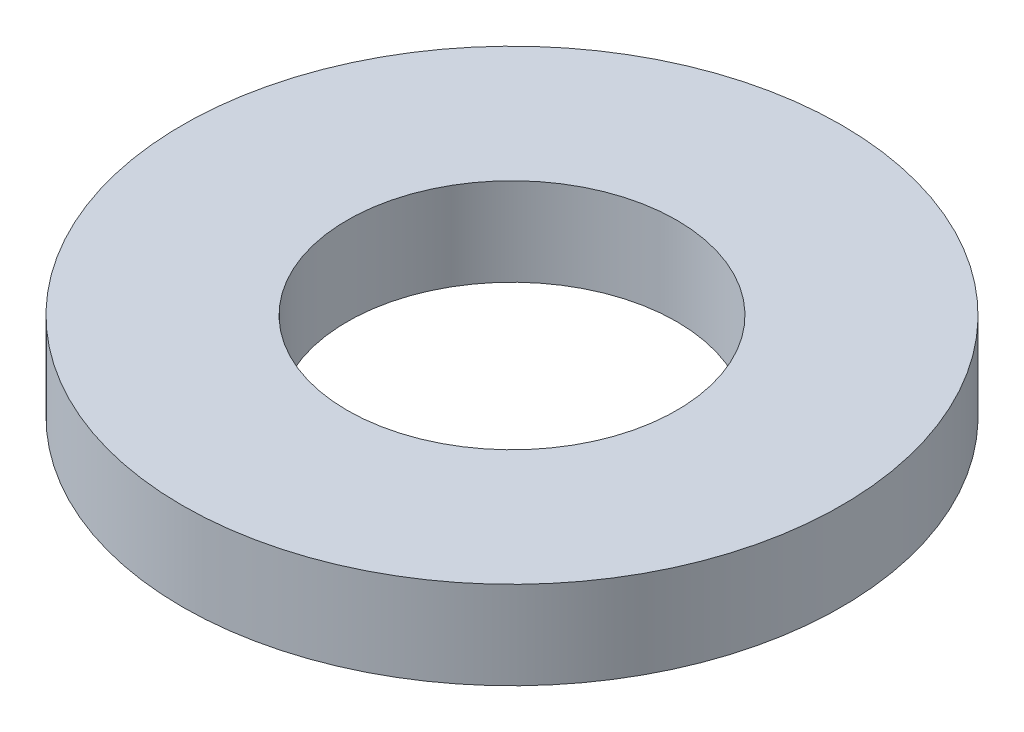
ISO-10303-21;
HEADER;
FILE_DESCRIPTION(('STEP AP214'),'2;1');
FILE_NAME('part.step','',(''),(''),'','','');
FILE_SCHEMA(('AUTOMOTIVE_DESIGN { 1 0 10303 214 1 1 1 1 }'));
ENDSEC;
DATA;
#1=APPLICATION_CONTEXT('core data for automotive mechanical design processes');
#2=APPLICATION_PROTOCOL_DEFINITION('international standard','automotive_design',2000,#1);
#3=PRODUCT_CONTEXT('',#1,'mechanical');
#4=PRODUCT('Part','Part','',(#3));
#5=PRODUCT_RELATED_PRODUCT_CATEGORY('part','',(#4));
#6=PRODUCT_DEFINITION_FORMATION('','',#4);
#7=PRODUCT_DEFINITION_CONTEXT('part definition',#1,'design');
#8=PRODUCT_DEFINITION('design','',#6,#7);
#9=PRODUCT_DEFINITION_SHAPE('','',#8);
#10=(LENGTH_UNIT() NAMED_UNIT(*) SI_UNIT(.MILLI.,.METRE.));
#11=(NAMED_UNIT(*) PLANE_ANGLE_UNIT() SI_UNIT($,.RADIAN.));
#12=(NAMED_UNIT(*) SI_UNIT($,.STERADIAN.) SOLID_ANGLE_UNIT());
#13=UNCERTAINTY_MEASURE_WITH_UNIT(LENGTH_MEASURE(1.E-05),#10,'distance_accuracy_value','');
#14=(GEOMETRIC_REPRESENTATION_CONTEXT(3) GLOBAL_UNCERTAINTY_ASSIGNED_CONTEXT((#13)) GLOBAL_UNIT_ASSIGNED_CONTEXT((#10,
#11,#12)) REPRESENTATION_CONTEXT('',''));
#15=CARTESIAN_POINT('',(0.,0.,0.));
#16=DIRECTION('',(0.,0.,1.));
#17=DIRECTION('',(1.,0.,0.));
#18=AXIS2_PLACEMENT_3D('',#15,#16,#17);
#19=CARTESIAN_POINT('',(0.,0.4,0.));
#20=DIRECTION('',(0.,1.,0.));
#21=DIRECTION('',(0.,0.,1.));
#22=AXIS2_PLACEMENT_3D('',#19,#20,#21);
#23=PLANE('',#22);
#24=CARTESIAN_POINT('',(0.,0.4,0.));
#25=DIRECTION('',(0.,1.,0.));
#26=DIRECTION('',(0.,0.,1.));
#27=AXIS2_PLACEMENT_3D('',#24,#25,#26);
#28=CIRCLE('',#27,3.);
#29=CARTESIAN_POINT('',(0.,0.4,3.));
#30=VERTEX_POINT('',#29);
#31=EDGE_CURVE('E10',#30,#30,#28,.T.);
#32=ORIENTED_EDGE('',*,*,#31,.T.);
#33=EDGE_LOOP('',(#32));
#34=FACE_BOUND('',#33,.T.);
#35=CARTESIAN_POINT('',(0.,0.4,0.));
#36=DIRECTION('',(0.,1.,0.));
#37=DIRECTION('',(0.,0.,1.));
#38=AXIS2_PLACEMENT_3D('',#35,#36,#37);
#39=CIRCLE('',#38,1.5);
#40=CARTESIAN_POINT('',(0.,0.4,1.5));
#41=VERTEX_POINT('',#40);
#42=EDGE_CURVE('E45',#41,#41,#39,.T.);
#43=ORIENTED_EDGE('',*,*,#42,.F.);
#44=EDGE_LOOP('',(#43));
#45=FACE_BOUND('',#44,.T.);
#46=ADVANCED_FACE('F34',(#34,#45),#23,.T.);
#47=CARTESIAN_POINT('',(0.,-0.4,0.));
#48=DIRECTION('',(0.,1.,0.));
#49=DIRECTION('',(0.,0.,1.));
#50=AXIS2_PLACEMENT_3D('',#47,#48,#49);
#51=PLANE('',#50);
#52=CARTESIAN_POINT('',(0.,-0.4,0.));
#53=DIRECTION('',(0.,1.,0.));
#54=DIRECTION('',(0.,0.,1.));
#55=AXIS2_PLACEMENT_3D('',#52,#53,#54);
#56=CIRCLE('',#55,3.);
#57=CARTESIAN_POINT('',(0.,-0.4,3.));
#58=VERTEX_POINT('',#57);
#59=EDGE_CURVE('E38',#58,#58,#56,.T.);
#60=ORIENTED_EDGE('',*,*,#59,.F.);
#61=EDGE_LOOP('',(#60));
#62=FACE_BOUND('',#61,.T.);
#63=CARTESIAN_POINT('',(0.,-0.4,0.));
#64=DIRECTION('',(0.,1.,0.));
#65=DIRECTION('',(0.,0.,1.));
#66=AXIS2_PLACEMENT_3D('',#63,#64,#65);
#67=CIRCLE('',#66,1.5);
#68=CARTESIAN_POINT('',(0.,-0.4,1.5));
#69=VERTEX_POINT('',#68);
#70=EDGE_CURVE('E47',#69,#69,#67,.T.);
#71=ORIENTED_EDGE('',*,*,#70,.T.);
#72=EDGE_LOOP('',(#71));
#73=FACE_BOUND('',#72,.T.);
#74=ADVANCED_FACE('F57',(#62,#73),#51,.F.);
#75=CARTESIAN_POINT('',(0.,0.4,0.));
#76=DIRECTION('',(0.,-1.,0.));
#77=DIRECTION('',(0.,0.,-1.));
#78=AXIS2_PLACEMENT_3D('',#75,#76,#77);
#79=CYLINDRICAL_SURFACE('',#78,3.);
#80=ORIENTED_EDGE('',*,*,#31,.F.);
#81=EDGE_LOOP('',(#80));
#82=FACE_BOUND('',#81,.T.);
#83=ORIENTED_EDGE('',*,*,#59,.T.);
#84=EDGE_LOOP('',(#83));
#85=FACE_BOUND('',#84,.T.);
#86=ADVANCED_FACE('F36',(#82,#85),#79,.T.);
#87=CARTESIAN_POINT('',(0.,0.4,0.));
#88=DIRECTION('',(0.,-1.,0.));
#89=DIRECTION('',(0.,0.,-1.));
#90=AXIS2_PLACEMENT_3D('',#87,#88,#89);
#91=CYLINDRICAL_SURFACE('',#90,1.5);
#92=ORIENTED_EDGE('',*,*,#42,.T.);
#93=EDGE_LOOP('',(#92));
#94=FACE_BOUND('',#93,.T.);
#95=ORIENTED_EDGE('',*,*,#70,.F.);
#96=EDGE_LOOP('',(#95));
#97=FACE_BOUND('',#96,.T.);
#98=ADVANCED_FACE('F53',(#94,#97),#91,.F.);
#99=CLOSED_SHELL('',(#46,#74,#86,#98));
#100=MANIFOLD_SOLID_BREP('B2',#99);
#101=ADVANCED_BREP_SHAPE_REPRESENTATION('',(#18,#100),#14);
#102=SHAPE_DEFINITION_REPRESENTATION(#9,#101);
ENDSEC;
END-ISO-10303-21;
